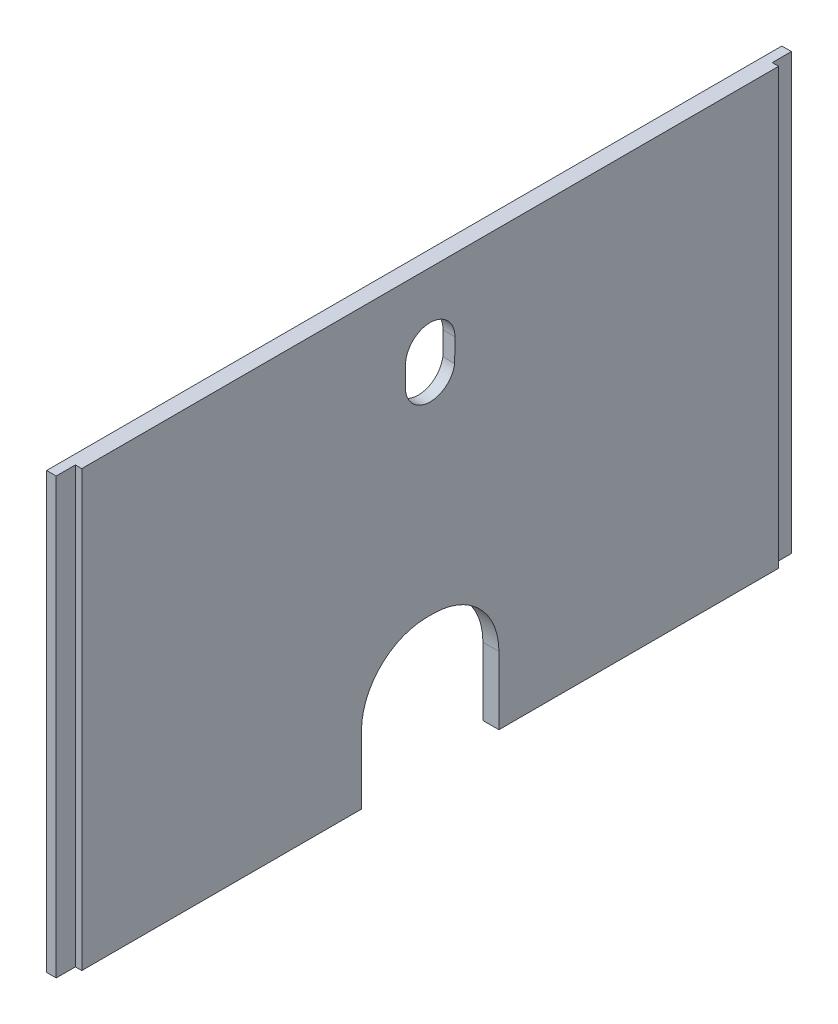
ISO-10303-21;
HEADER;
FILE_DESCRIPTION(('STEP AP214'),'2;1');
FILE_NAME('part.step','',(''),(''),'','','');
FILE_SCHEMA(('AUTOMOTIVE_DESIGN { 1 0 10303 214 1 1 1 1 }'));
ENDSEC;
DATA;
#1=APPLICATION_CONTEXT('core data for automotive mechanical design processes');
#2=APPLICATION_PROTOCOL_DEFINITION('international standard','automotive_design',2000,#1);
#3=PRODUCT_CONTEXT('',#1,'mechanical');
#4=PRODUCT('Part','Part','',(#3));
#5=PRODUCT_RELATED_PRODUCT_CATEGORY('part','',(#4));
#6=PRODUCT_DEFINITION_FORMATION('','',#4);
#7=PRODUCT_DEFINITION_CONTEXT('part definition',#1,'design');
#8=PRODUCT_DEFINITION('design','',#6,#7);
#9=PRODUCT_DEFINITION_SHAPE('','',#8);
#10=(LENGTH_UNIT() NAMED_UNIT(*) SI_UNIT(.MILLI.,.METRE.));
#11=(NAMED_UNIT(*) PLANE_ANGLE_UNIT() SI_UNIT($,.RADIAN.));
#12=(NAMED_UNIT(*) SI_UNIT($,.STERADIAN.) SOLID_ANGLE_UNIT());
#13=UNCERTAINTY_MEASURE_WITH_UNIT(LENGTH_MEASURE(1.E-05),#10,'distance_accuracy_value','');
#14=(GEOMETRIC_REPRESENTATION_CONTEXT(3) GLOBAL_UNCERTAINTY_ASSIGNED_CONTEXT((#13)) GLOBAL_UNIT_ASSIGNED_CONTEXT((#10,
#11,#12)) REPRESENTATION_CONTEXT('',''));
#15=CARTESIAN_POINT('',(0.,0.,0.));
#16=DIRECTION('',(0.,0.,1.));
#17=DIRECTION('',(1.,0.,0.));
#18=AXIS2_PLACEMENT_3D('',#15,#16,#17);
#19=CARTESIAN_POINT('',(0.499999999999993,-34.,0.));
#20=DIRECTION('',(1.,0.,0.));
#21=DIRECTION('',(0.,0.,-1.));
#22=AXIS2_PLACEMENT_3D('',#19,#20,#21);
#23=PLANE('',#22);
#24=DIRECTION('',(0.,1.,0.));
#25=VECTOR('',#24,1.);
#26=CARTESIAN_POINT('',(0.499999999999994,0.,-10.75));
#27=LINE('',#26,#25);
#28=CARTESIAN_POINT('',(0.499999999999992,-34.,-10.75));
#29=VERTEX_POINT('',#28);
#30=CARTESIAN_POINT('',(0.499999999999992,-23.3838115756359,-10.75));
#31=VERTEX_POINT('',#30);
#32=EDGE_CURVE('E429',#29,#31,#27,.T.);
#33=ORIENTED_EDGE('',*,*,#32,.T.);
#34=CARTESIAN_POINT('',(0.499999999999994,-23.3838115756359,-0.500000000000026));
#35=DIRECTION('',(1.,0.,0.));
#36=DIRECTION('',(0.,0.,-1.));
#37=AXIS2_PLACEMENT_3D('',#34,#35,#36);
#38=CIRCLE('',#37,10.25);
#39=CARTESIAN_POINT('',(0.499999999999994,-13.1338115756359,-0.500000000000025));
#40=VERTEX_POINT('',#39);
#41=EDGE_CURVE('E432',#40,#31,#38,.F.);
#42=ORIENTED_EDGE('',*,*,#41,.F.);
#43=DIRECTION('',(0.,0.,1.));
#44=VECTOR('',#43,1.);
#45=CARTESIAN_POINT('',(0.499999999999994,-13.1338115756359,3.37854945034374E-13));
#46=LINE('',#45,#44);
#47=CARTESIAN_POINT('',(0.499999999999994,-13.1338115756359,0.499999999999974));
#48=VERTEX_POINT('',#47);
#49=EDGE_CURVE('E421',#40,#48,#46,.T.);
#50=ORIENTED_EDGE('',*,*,#49,.T.);
#51=CARTESIAN_POINT('',(0.499999999999994,-23.3838115756359,0.499999999999974));
#52=DIRECTION('',(1.,0.,0.));
#53=DIRECTION('',(0.,0.,-1.));
#54=AXIS2_PLACEMENT_3D('',#51,#52,#53);
#55=CIRCLE('',#54,10.25);
#56=CARTESIAN_POINT('',(0.499999999999995,-23.3838115756359,10.75));
#57=VERTEX_POINT('',#56);
#58=EDGE_CURVE('E424',#57,#48,#55,.F.);
#59=ORIENTED_EDGE('',*,*,#58,.F.);
#60=DIRECTION('',(0.,1.,0.));
#61=VECTOR('',#60,1.);
#62=CARTESIAN_POINT('',(0.499999999999994,0.,10.75));
#63=LINE('',#62,#61);
#64=CARTESIAN_POINT('',(0.499999999999994,-34.,10.75));
#65=VERTEX_POINT('',#64);
#66=EDGE_CURVE('E427',#65,#57,#63,.T.);
#67=ORIENTED_EDGE('',*,*,#66,.F.);
#68=DIRECTION('',(0.,0.,-1.));
#69=VECTOR('',#68,1.);
#70=CARTESIAN_POINT('',(0.499999999999993,-34.,0.));
#71=LINE('',#70,#69);
#72=CARTESIAN_POINT('',(0.5,-34.,57.5));
#73=VERTEX_POINT('',#72);
#74=EDGE_CURVE('E460',#73,#65,#71,.T.);
#75=ORIENTED_EDGE('',*,*,#74,.F.);
#76=DIRECTION('',(0.,1.,0.));
#77=VECTOR('',#76,1.);
#78=CARTESIAN_POINT('',(0.5,-34.,57.5));
#79=LINE('',#78,#77);
#80=CARTESIAN_POINT('',(0.5,34.,57.5));
#81=VERTEX_POINT('',#80);
#82=EDGE_CURVE('E499',#73,#81,#79,.T.);
#83=ORIENTED_EDGE('',*,*,#82,.T.);
#84=DIRECTION('',(0.,0.,-1.));
#85=VECTOR('',#84,1.);
#86=CARTESIAN_POINT('',(0.499999999999993,34.,0.));
#87=LINE('',#86,#85);
#88=CARTESIAN_POINT('',(0.499999999999194,34.,-57.5));
#89=VERTEX_POINT('',#88);
#90=EDGE_CURVE('E459',#81,#89,#87,.T.);
#91=ORIENTED_EDGE('',*,*,#90,.T.);
#92=DIRECTION('',(0.,1.,0.));
#93=VECTOR('',#92,1.);
#94=CARTESIAN_POINT('',(0.499999999999194,-34.,-57.5));
#95=LINE('',#94,#93);
#96=CARTESIAN_POINT('',(0.499999999999194,-34.,-57.5));
#97=VERTEX_POINT('',#96);
#98=EDGE_CURVE('E479',#97,#89,#95,.T.);
#99=ORIENTED_EDGE('',*,*,#98,.F.);
#100=EDGE_CURVE('E464',#29,#97,#71,.T.);
#101=ORIENTED_EDGE('',*,*,#100,.F.);
#102=EDGE_LOOP('',(#33,#42,#50,#59,#67,#75,#83,#91,#99,#101));
#103=FACE_BOUND('',#102,.T.);
#104=DIRECTION('',(0.,0.,1.));
#105=VECTOR('',#104,1.);
#106=CARTESIAN_POINT('',(0.499999999999992,14.5500000000001,-4.49999999999981));
#107=LINE('',#106,#105);
#108=CARTESIAN_POINT('',(0.499999999999992,14.5500000000001,-4.49999999999981));
#109=VERTEX_POINT('',#108);
#110=CARTESIAN_POINT('',(0.499999999999993,14.5500000000001,4.50000000000025));
#111=VERTEX_POINT('',#110);
#112=EDGE_CURVE('E377',#109,#111,#107,.T.);
#113=ORIENTED_EDGE('',*,*,#112,.F.);
#114=DIRECTION('',(0.,-1.,0.));
#115=VECTOR('',#114,1.);
#116=CARTESIAN_POINT('',(0.499999999999992,26.5500000000001,-4.49999999999981));
#117=LINE('',#116,#115);
#118=CARTESIAN_POINT('',(0.499999999999992,26.5500000000001,-4.49999999999981));
#119=VERTEX_POINT('',#118);
#120=EDGE_CURVE('E361',#119,#109,#117,.T.);
#121=ORIENTED_EDGE('',*,*,#120,.F.);
#122=DIRECTION('',(0.,0.,-1.));
#123=VECTOR('',#122,1.);
#124=CARTESIAN_POINT('',(0.499999999999992,26.5500000000001,-4.49999999999981));
#125=LINE('',#124,#123);
#126=CARTESIAN_POINT('',(0.499999999999993,26.5500000000001,4.50000000000025));
#127=VERTEX_POINT('',#126);
#128=EDGE_CURVE('E366',#127,#119,#125,.T.);
#129=ORIENTED_EDGE('',*,*,#128,.F.);
#130=DIRECTION('',(0.,1.,0.));
#131=VECTOR('',#130,1.);
#132=CARTESIAN_POINT('',(0.499999999999993,26.5500000000001,4.50000000000025));
#133=LINE('',#132,#131);
#134=EDGE_CURVE('E380',#111,#127,#133,.T.);
#135=ORIENTED_EDGE('',*,*,#134,.F.);
#136=EDGE_LOOP('',(#113,#121,#129,#135));
#137=FACE_BOUND('',#136,.T.);
#138=DIRECTION('',(0.,-1.,0.));
#139=VECTOR('',#138,1.);
#140=CARTESIAN_POINT('',(0.499999999999991,0.,-14.75));
#141=LINE('',#140,#139);
#142=CARTESIAN_POINT('',(0.499999999999991,7.49999999999999,-14.75));
#143=VERTEX_POINT('',#142);
#144=CARTESIAN_POINT('',(0.499999999999991,2.5,-14.75));
#145=VERTEX_POINT('',#144);
#146=EDGE_CURVE('E356',#143,#145,#141,.T.);
#147=ORIENTED_EDGE('',*,*,#146,.F.);
#148=DIRECTION('',(0.,0.,-1.));
#149=VECTOR('',#148,1.);
#150=CARTESIAN_POINT('',(0.499999999999993,7.49999999999999,0.));
#151=LINE('',#150,#149);
#152=CARTESIAN_POINT('',(0.499999999999992,7.49999999999999,-5.99999999999973));
#153=VERTEX_POINT('',#152);
#154=EDGE_CURVE('E284',#153,#143,#151,.T.);
#155=ORIENTED_EDGE('',*,*,#154,.F.);
#156=DIRECTION('',(0.,-1.,0.));
#157=VECTOR('',#156,1.);
#158=CARTESIAN_POINT('',(0.499999999999992,7.49999999999999,-5.99999999999973));
#159=LINE('',#158,#157);
#160=CARTESIAN_POINT('',(0.499999999999992,4.49999999999999,-5.99999999999973));
#161=VERTEX_POINT('',#160);
#162=EDGE_CURVE('E324',#153,#161,#159,.T.);
#163=ORIENTED_EDGE('',*,*,#162,.T.);
#164=DIRECTION('',(0.,0.,1.));
#165=VECTOR('',#164,1.);
#166=CARTESIAN_POINT('',(0.499999999999993,4.49999999999999,0.));
#167=LINE('',#166,#165);
#168=CARTESIAN_POINT('',(0.499999999999993,4.49999999999999,5.00000000000027));
#169=VERTEX_POINT('',#168);
#170=EDGE_CURVE('E353',#161,#169,#167,.T.);
#171=ORIENTED_EDGE('',*,*,#170,.T.);
#172=DIRECTION('',(0.,-1.,0.));
#173=VECTOR('',#172,1.);
#174=CARTESIAN_POINT('',(0.499999999999993,7.49999999999999,5.00000000000027));
#175=LINE('',#174,#173);
#176=CARTESIAN_POINT('',(0.499999999999993,7.49999999999999,5.00000000000027));
#177=VERTEX_POINT('',#176);
#178=EDGE_CURVE('E270',#177,#169,#175,.T.);
#179=ORIENTED_EDGE('',*,*,#178,.F.);
#180=CARTESIAN_POINT('',(0.499999999999995,7.49999999999999,14.75));
#181=VERTEX_POINT('',#180);
#182=EDGE_CURVE('E291',#181,#177,#151,.T.);
#183=ORIENTED_EDGE('',*,*,#182,.F.);
#184=DIRECTION('',(0.,-1.,0.));
#185=VECTOR('',#184,1.);
#186=CARTESIAN_POINT('',(0.499999999999995,0.,14.75));
#187=LINE('',#186,#185);
#188=CARTESIAN_POINT('',(0.499999999999995,2.5,14.75));
#189=VERTEX_POINT('',#188);
#190=EDGE_CURVE('E350',#181,#189,#187,.T.);
#191=ORIENTED_EDGE('',*,*,#190,.T.);
#192=DIRECTION('',(0.,0.,1.));
#193=VECTOR('',#192,1.);
#194=CARTESIAN_POINT('',(0.499999999999993,2.5,0.));
#195=LINE('',#194,#193);
#196=EDGE_CURVE('E347',#145,#189,#195,.T.);
#197=ORIENTED_EDGE('',*,*,#196,.F.);
#198=EDGE_LOOP('',(#147,#155,#163,#171,#179,#183,#191,#197));
#199=FACE_BOUND('',#198,.T.);
#200=ADVANCED_FACE('F41',(#103,#137,#199),#23,.F.);
#201=CARTESIAN_POINT('',(-7.50000000000001,2.5,0.));
#202=DIRECTION('',(0.,1.,0.));
#203=DIRECTION('',(0.,0.,1.));
#204=AXIS2_PLACEMENT_3D('',#201,#202,#203);
#205=PLANE('',#204);
#206=DIRECTION('',(0.,0.,1.));
#207=VECTOR('',#206,1.);
#208=CARTESIAN_POINT('',(-5.93549467935518,2.5,0.));
#209=LINE('',#208,#207);
#210=CARTESIAN_POINT('',(-5.93549467935518,2.5,-14.75));
#211=VERTEX_POINT('',#210);
#212=CARTESIAN_POINT('',(-5.93549467935518,2.5,14.75));
#213=VERTEX_POINT('',#212);
#214=EDGE_CURVE('E344',#211,#213,#209,.T.);
#215=ORIENTED_EDGE('',*,*,#214,.F.);
#216=DIRECTION('',(1.,0.,0.));
#217=VECTOR('',#216,1.);
#218=CARTESIAN_POINT('',(-7.50000000000001,2.5,-14.75));
#219=LINE('',#218,#217);
#220=EDGE_CURVE('E266',#211,#145,#219,.T.);
#221=ORIENTED_EDGE('',*,*,#220,.T.);
#222=ORIENTED_EDGE('',*,*,#196,.T.);
#223=DIRECTION('',(1.,0.,0.));
#224=VECTOR('',#223,1.);
#225=CARTESIAN_POINT('',(-7.50000000000001,2.5,14.75));
#226=LINE('',#225,#224);
#227=EDGE_CURVE('E359',#213,#189,#226,.T.);
#228=ORIENTED_EDGE('',*,*,#227,.F.);
#229=EDGE_LOOP('',(#215,#221,#222,#228));
#230=FACE_BOUND('',#229,.T.);
#231=ADVANCED_FACE('F596',(#230),#205,.F.);
#232=CARTESIAN_POINT('',(-7.50000000000001,0.,14.75));
#233=DIRECTION('',(0.,0.,1.));
#234=DIRECTION('',(0.,-1.,0.));
#235=AXIS2_PLACEMENT_3D('',#232,#233,#234);
#236=PLANE('',#235);
#237=ORIENTED_EDGE('',*,*,#190,.F.);
#238=DIRECTION('',(1.,0.,0.));
#239=VECTOR('',#238,1.);
#240=CARTESIAN_POINT('',(0.,7.49999999999999,14.75));
#241=LINE('',#240,#239);
#242=CARTESIAN_POINT('',(-5.93549467935518,7.49999999999999,14.75));
#243=VERTEX_POINT('',#242);
#244=EDGE_CURVE('E279',#243,#181,#241,.T.);
#245=ORIENTED_EDGE('',*,*,#244,.F.);
#246=DIRECTION('',(0.,1.,0.));
#247=VECTOR('',#246,1.);
#248=CARTESIAN_POINT('',(-5.93549467935518,-3.50000000000001,14.75));
#249=LINE('',#248,#247);
#250=EDGE_CURVE('E269',#213,#243,#249,.T.);
#251=ORIENTED_EDGE('',*,*,#250,.F.);
#252=ORIENTED_EDGE('',*,*,#227,.T.);
#253=EDGE_LOOP('',(#237,#245,#251,#252));
#254=FACE_BOUND('',#253,.T.);
#255=ADVANCED_FACE('F601',(#254),#236,.T.);
#256=CARTESIAN_POINT('',(-7.50000000000001,4.49999999999999,0.));
#257=DIRECTION('',(0.,1.,0.));
#258=DIRECTION('',(0.,0.,1.));
#259=AXIS2_PLACEMENT_3D('',#256,#257,#258);
#260=PLANE('',#259);
#261=DIRECTION('',(1.,0.,0.));
#262=VECTOR('',#261,1.);
#263=CARTESIAN_POINT('',(0.,4.49999999999999,5.00000000000028));
#264=LINE('',#263,#262);
#265=CARTESIAN_POINT('',(-1.93549467935518,4.49999999999999,5.00000000000027));
#266=VERTEX_POINT('',#265);
#267=EDGE_CURVE('E315',#266,#169,#264,.T.);
#268=ORIENTED_EDGE('',*,*,#267,.T.);
#269=ORIENTED_EDGE('',*,*,#170,.F.);
#270=DIRECTION('',(-1.,0.,0.));
#271=VECTOR('',#270,1.);
#272=CARTESIAN_POINT('',(0.,4.49999999999999,-5.99999999999973));
#273=LINE('',#272,#271);
#274=CARTESIAN_POINT('',(-1.93549467935518,4.49999999999999,-5.99999999999973));
#275=VERTEX_POINT('',#274);
#276=EDGE_CURVE('E285',#161,#275,#273,.T.);
#277=ORIENTED_EDGE('',*,*,#276,.T.);
#278=DIRECTION('',(0.,0.,-1.));
#279=VECTOR('',#278,1.);
#280=CARTESIAN_POINT('',(-1.93549467935518,4.49999999999999,0.));
#281=LINE('',#280,#279);
#282=CARTESIAN_POINT('',(-1.93549467935518,4.49999999999999,-12.9999999999997));
#283=VERTEX_POINT('',#282);
#284=EDGE_CURVE('E287',#275,#283,#281,.T.);
#285=ORIENTED_EDGE('',*,*,#284,.T.);
#286=DIRECTION('',(-1.,0.,0.));
#287=VECTOR('',#286,1.);
#288=CARTESIAN_POINT('',(0.,4.49999999999999,-12.9999999999997));
#289=LINE('',#288,#287);
#290=CARTESIAN_POINT('',(-3.93549467935518,4.49999999999999,-12.9999999999997));
#291=VERTEX_POINT('',#290);
#292=EDGE_CURVE('E321',#283,#291,#289,.T.);
#293=ORIENTED_EDGE('',*,*,#292,.T.);
#294=DIRECTION('',(0.,0.,1.));
#295=VECTOR('',#294,1.);
#296=CARTESIAN_POINT('',(-3.93549467935518,4.49999999999999,0.));
#297=LINE('',#296,#295);
#298=CARTESIAN_POINT('',(-3.93549467935518,4.49999999999999,13.0000000000003));
#299=VERTEX_POINT('',#298);
#300=EDGE_CURVE('E319',#291,#299,#297,.T.);
#301=ORIENTED_EDGE('',*,*,#300,.T.);
#302=DIRECTION('',(1.,0.,0.));
#303=VECTOR('',#302,1.);
#304=CARTESIAN_POINT('',(0.,4.49999999999999,13.0000000000003));
#305=LINE('',#304,#303);
#306=CARTESIAN_POINT('',(-1.93549467935518,4.49999999999999,13.0000000000003));
#307=VERTEX_POINT('',#306);
#308=EDGE_CURVE('E61',#299,#307,#305,.T.);
#309=ORIENTED_EDGE('',*,*,#308,.T.);
#310=DIRECTION('',(0.,0.,-1.));
#311=VECTOR('',#310,1.);
#312=CARTESIAN_POINT('',(-1.93549467935518,4.49999999999999,0.));
#313=LINE('',#312,#311);
#314=EDGE_CURVE('E56',#307,#266,#313,.T.);
#315=ORIENTED_EDGE('',*,*,#314,.T.);
#316=EDGE_LOOP('',(#268,#269,#277,#285,#293,#301,#309,#315));
#317=FACE_BOUND('',#316,.T.);
#318=ADVANCED_FACE('F771',(#317),#260,.T.);
#319=CARTESIAN_POINT('',(-7.50000000000001,0.,-14.75));
#320=DIRECTION('',(0.,0.,1.));
#321=DIRECTION('',(0.,-1.,0.));
#322=AXIS2_PLACEMENT_3D('',#319,#320,#321);
#323=PLANE('',#322);
#324=DIRECTION('',(0.,1.,0.));
#325=VECTOR('',#324,1.);
#326=CARTESIAN_POINT('',(-5.93549467935518,-3.50000000000001,-14.75));
#327=LINE('',#326,#325);
#328=CARTESIAN_POINT('',(-5.93549467935518,7.49999999999999,-14.75));
#329=VERTEX_POINT('',#328);
#330=EDGE_CURVE('E260',#211,#329,#327,.T.);
#331=ORIENTED_EDGE('',*,*,#330,.T.);
#332=DIRECTION('',(-1.,0.,0.));
#333=VECTOR('',#332,1.);
#334=CARTESIAN_POINT('',(0.,7.49999999999999,-14.75));
#335=LINE('',#334,#333);
#336=EDGE_CURVE('E265',#143,#329,#335,.T.);
#337=ORIENTED_EDGE('',*,*,#336,.F.);
#338=ORIENTED_EDGE('',*,*,#146,.T.);
#339=ORIENTED_EDGE('',*,*,#220,.F.);
#340=EDGE_LOOP('',(#331,#337,#338,#339));
#341=FACE_BOUND('',#340,.T.);
#342=ADVANCED_FACE('F262',(#341),#323,.F.);
#343=CARTESIAN_POINT('',(-12.7523582806986,-0.0475998106973776,-3.57234991047825));
#344=DIRECTION('',(0.,0.013323326929512,0.999911240540644));
#345=DIRECTION('',(0.,-0.999911240540644,0.013323326929512));
#346=AXIS2_PLACEMENT_3D('',#343,#344,#345);
#347=PLANE('',#346);
#348=DIRECTION('',(1.,0.,0.));
#349=VECTOR('',#348,1.);
#350=CARTESIAN_POINT('',(-12.7523582806986,22.6661884243642,-3.875));
#351=LINE('',#350,#349);
#352=CARTESIAN_POINT('',(1.14999999999999,22.6661884243642,-3.875));
#353=VERTEX_POINT('',#352);
#354=CARTESIAN_POINT('',(3.,22.6661884243642,-3.875));
#355=VERTEX_POINT('',#354);
#356=EDGE_CURVE('E412',#353,#355,#351,.T.);
#357=ORIENTED_EDGE('',*,*,#356,.F.);
#358=DIRECTION('',(0.,-0.999911240540644,0.013323326929512));
#359=VECTOR('',#358,1.);
#360=CARTESIAN_POINT('',(1.14999999999999,-0.0475998106973776,-3.57234991047825));
#361=LINE('',#360,#359);
#362=CARTESIAN_POINT('',(1.14999999999999,19.0576458345906,-3.82691793959969));
#363=VERTEX_POINT('',#362);
#364=EDGE_CURVE('E397',#353,#363,#361,.T.);
#365=ORIENTED_EDGE('',*,*,#364,.T.);
#366=DIRECTION('',(1.,0.,0.));
#367=VECTOR('',#366,1.);
#368=CARTESIAN_POINT('',(-12.7523582806986,19.0576458345906,-3.82691793959969));
#369=LINE('',#368,#367);
#370=CARTESIAN_POINT('',(3.,19.0576458345906,-3.82691793959969));
#371=VERTEX_POINT('',#370);
#372=EDGE_CURVE('E413',#363,#371,#369,.T.);
#373=ORIENTED_EDGE('',*,*,#372,.T.);
#374=DIRECTION('',(0.,-0.999911240540644,0.013323326929512));
#375=VECTOR('',#374,1.);
#376=CARTESIAN_POINT('',(3.,-0.0475998106973776,-3.57234991047825));
#377=LINE('',#376,#375);
#378=EDGE_CURVE('E400',#355,#371,#377,.T.);
#379=ORIENTED_EDGE('',*,*,#378,.F.);
#380=EDGE_LOOP('',(#357,#365,#373,#379));
#381=FACE_BOUND('',#380,.T.);
#382=ADVANCED_FACE('F659',(#381),#347,.T.);
#383=CARTESIAN_POINT('',(-12.7523582806986,19.6661884243642,2.21202882386381E-13));
#384=DIRECTION('',(1.,0.,0.));
#385=DIRECTION('',(0.,0.,-1.));
#386=AXIS2_PLACEMENT_3D('',#383,#384,#385);
#387=CYLINDRICAL_SURFACE('',#386,3.875);
#388=CARTESIAN_POINT('',(1.14999999999999,19.6661884243642,2.21202882386381E-13));
#389=DIRECTION('',(-1.,0.,0.));
#390=DIRECTION('',(0.,0.,1.));
#391=AXIS2_PLACEMENT_3D('',#388,#389,#390);
#392=CIRCLE('',#391,3.875);
#393=CARTESIAN_POINT('',(1.14999999999999,19.0576458345906,3.82691793960013));
#394=VERTEX_POINT('',#393);
#395=EDGE_CURVE('E395',#394,#363,#392,.F.);
#396=ORIENTED_EDGE('',*,*,#395,.F.);
#397=DIRECTION('',(1.,0.,0.));
#398=VECTOR('',#397,1.);
#399=CARTESIAN_POINT('',(-12.7523582806986,19.0576458345906,3.82691793960013));
#400=LINE('',#399,#398);
#401=CARTESIAN_POINT('',(3.,19.0576458345906,3.82691793960013));
#402=VERTEX_POINT('',#401);
#403=EDGE_CURVE('E416',#394,#402,#400,.T.);
#404=ORIENTED_EDGE('',*,*,#403,.T.);
#405=CARTESIAN_POINT('',(3.,19.6661884243642,2.21202882386381E-13));
#406=DIRECTION('',(1.,0.,0.));
#407=DIRECTION('',(0.,0.,-1.));
#408=AXIS2_PLACEMENT_3D('',#405,#406,#407);
#409=CIRCLE('',#408,3.875);
#410=EDGE_CURVE('E409',#402,#371,#409,.T.);
#411=ORIENTED_EDGE('',*,*,#410,.T.);
#412=ORIENTED_EDGE('',*,*,#372,.F.);
#413=EDGE_LOOP('',(#396,#404,#411,#412));
#414=FACE_BOUND('',#413,.T.);
#415=ADVANCED_FACE('F664',(#414),#387,.F.);
#416=CARTESIAN_POINT('',(-12.7523582806986,-0.0475998106969768,3.57234991048104));
#417=DIRECTION('',(0.,-0.0133233269293894,0.999911240540645));
#418=DIRECTION('',(0.,-0.999911240540646,-0.0133233269293894));
#419=AXIS2_PLACEMENT_3D('',#416,#417,#418);
#420=PLANE('',#419);
#421=DIRECTION('',(0.,-0.999911240540646,-0.0133233269293894));
#422=VECTOR('',#421,1.);
#423=CARTESIAN_POINT('',(1.14999999999999,-0.0475998106969769,3.57234991048104));
#424=LINE('',#423,#422);
#425=CARTESIAN_POINT('',(1.14999999999999,22.6661884243642,3.875));
#426=VERTEX_POINT('',#425);
#427=EDGE_CURVE('E387',#426,#394,#424,.T.);
#428=ORIENTED_EDGE('',*,*,#427,.F.);
#429=DIRECTION('',(1.,0.,0.));
#430=VECTOR('',#429,1.);
#431=CARTESIAN_POINT('',(-12.7523582806986,22.6661884243642,3.875));
#432=LINE('',#431,#430);
#433=CARTESIAN_POINT('',(3.,22.6661884243642,3.875));
#434=VERTEX_POINT('',#433);
#435=EDGE_CURVE('E418',#426,#434,#432,.T.);
#436=ORIENTED_EDGE('',*,*,#435,.T.);
#437=DIRECTION('',(0.,-0.999911240540646,-0.0133233269293894));
#438=VECTOR('',#437,1.);
#439=CARTESIAN_POINT('',(3.,-0.0475998106969768,3.57234991048104));
#440=LINE('',#439,#438);
#441=EDGE_CURVE('E406',#434,#402,#440,.T.);
#442=ORIENTED_EDGE('',*,*,#441,.T.);
#443=ORIENTED_EDGE('',*,*,#403,.F.);
#444=EDGE_LOOP('',(#428,#436,#442,#443));
#445=FACE_BOUND('',#444,.T.);
#446=ADVANCED_FACE('F676',(#445),#420,.F.);
#447=CARTESIAN_POINT('',(-12.7523582806986,22.6661884243642,0.));
#448=DIRECTION('',(1.,0.,0.));
#449=DIRECTION('',(0.,0.,-1.));
#450=AXIS2_PLACEMENT_3D('',#447,#448,#449);
#451=CYLINDRICAL_SURFACE('',#450,3.875);
#452=CARTESIAN_POINT('',(1.14999999999999,22.6661884243642,0.));
#453=DIRECTION('',(-1.,0.,0.));
#454=DIRECTION('',(0.,0.,1.));
#455=AXIS2_PLACEMENT_3D('',#452,#453,#454);
#456=CIRCLE('',#455,3.875);
#457=EDGE_CURVE('E11',#353,#426,#456,.F.);
#458=ORIENTED_EDGE('',*,*,#457,.F.);
#459=ORIENTED_EDGE('',*,*,#356,.T.);
#460=CARTESIAN_POINT('',(3.,22.6661884243642,0.));
#461=DIRECTION('',(1.,0.,0.));
#462=DIRECTION('',(0.,0.,-1.));
#463=AXIS2_PLACEMENT_3D('',#460,#461,#462);
#464=CIRCLE('',#463,3.875);
#465=EDGE_CURVE('E403',#355,#434,#464,.T.);
#466=ORIENTED_EDGE('',*,*,#465,.T.);
#467=ORIENTED_EDGE('',*,*,#435,.F.);
#468=EDGE_LOOP('',(#458,#459,#466,#467));
#469=FACE_BOUND('',#468,.T.);
#470=ADVANCED_FACE('F608',(#469),#451,.F.);
#471=CARTESIAN_POINT('',(3.,0.,0.));
#472=DIRECTION('',(1.,0.,0.));
#473=DIRECTION('',(0.,0.,-1.));
#474=AXIS2_PLACEMENT_3D('',#471,#472,#473);
#475=PLANE('',#474);
#476=CARTESIAN_POINT('',(3.,-23.3838115756359,-0.500000000000026));
#477=DIRECTION('',(1.,0.,0.));
#478=DIRECTION('',(0.,0.,-1.));
#479=AXIS2_PLACEMENT_3D('',#476,#477,#478);
#480=CIRCLE('',#479,10.25);
#481=CARTESIAN_POINT('',(3.,-23.3838115756359,-10.75));
#482=VERTEX_POINT('',#481);
#483=CARTESIAN_POINT('',(3.,-13.1338115756359,-0.500000000000025));
#484=VERTEX_POINT('',#483);
#485=EDGE_CURVE('E435',#482,#484,#480,.T.);
#486=ORIENTED_EDGE('',*,*,#485,.F.);
#487=DIRECTION('',(0.,-1.,0.));
#488=VECTOR('',#487,1.);
#489=CARTESIAN_POINT('',(3.,0.,-10.75));
#490=LINE('',#489,#488);
#491=CARTESIAN_POINT('',(3.,-34.,-10.75));
#492=VERTEX_POINT('',#491);
#493=EDGE_CURVE('E415',#482,#492,#490,.T.);
#494=ORIENTED_EDGE('',*,*,#493,.T.);
#495=DIRECTION('',(0.,0.,-1.));
#496=VECTOR('',#495,1.);
#497=CARTESIAN_POINT('',(3.,-34.,60.));
#498=LINE('',#497,#496);
#499=CARTESIAN_POINT('',(3.,-34.,-54.5));
#500=VERTEX_POINT('',#499);
#501=EDGE_CURVE('E517',#492,#500,#498,.T.);
#502=ORIENTED_EDGE('',*,*,#501,.T.);
#503=DIRECTION('',(0.,1.,0.));
#504=VECTOR('',#503,1.);
#505=CARTESIAN_POINT('',(3.,-34.,-54.5));
#506=LINE('',#505,#504);
#507=CARTESIAN_POINT('',(3.,34.,-54.5));
#508=VERTEX_POINT('',#507);
#509=EDGE_CURVE('E508',#500,#508,#506,.T.);
#510=ORIENTED_EDGE('',*,*,#509,.T.);
#511=DIRECTION('',(0.,0.,1.));
#512=VECTOR('',#511,1.);
#513=CARTESIAN_POINT('',(3.,34.,60.));
#514=LINE('',#513,#512);
#515=CARTESIAN_POINT('',(3.,34.,54.5));
#516=VERTEX_POINT('',#515);
#517=EDGE_CURVE('E501',#508,#516,#514,.T.);
#518=ORIENTED_EDGE('',*,*,#517,.T.);
#519=DIRECTION('',(0.,1.,0.));
#520=VECTOR('',#519,1.);
#521=CARTESIAN_POINT('',(3.,-34.,54.5));
#522=LINE('',#521,#520);
#523=CARTESIAN_POINT('',(3.,-34.,54.5));
#524=VERTEX_POINT('',#523);
#525=EDGE_CURVE('E506',#524,#516,#522,.T.);
#526=ORIENTED_EDGE('',*,*,#525,.F.);
#527=CARTESIAN_POINT('',(3.,-34.,10.75));
#528=VERTEX_POINT('',#527);
#529=EDGE_CURVE('E49',#524,#528,#498,.T.);
#530=ORIENTED_EDGE('',*,*,#529,.T.);
#531=DIRECTION('',(0.,-1.,0.));
#532=VECTOR('',#531,1.);
#533=CARTESIAN_POINT('',(3.,0.,10.75));
#534=LINE('',#533,#532);
#535=CARTESIAN_POINT('',(3.,-23.3838115756359,10.75));
#536=VERTEX_POINT('',#535);
#537=EDGE_CURVE('E444',#536,#528,#534,.T.);
#538=ORIENTED_EDGE('',*,*,#537,.F.);
#539=CARTESIAN_POINT('',(3.,-23.3838115756359,0.499999999999974));
#540=DIRECTION('',(1.,0.,0.));
#541=DIRECTION('',(0.,0.,-1.));
#542=AXIS2_PLACEMENT_3D('',#539,#540,#541);
#543=CIRCLE('',#542,10.25);
#544=CARTESIAN_POINT('',(3.,-13.1338115756359,0.499999999999974));
#545=VERTEX_POINT('',#544);
#546=EDGE_CURVE('E441',#545,#536,#543,.T.);
#547=ORIENTED_EDGE('',*,*,#546,.F.);
#548=DIRECTION('',(0.,0.,-1.));
#549=VECTOR('',#548,1.);
#550=CARTESIAN_POINT('',(3.,-13.1338115756359,3.41752969039673E-13));
#551=LINE('',#550,#549);
#552=EDGE_CURVE('E438',#545,#484,#551,.T.);
#553=ORIENTED_EDGE('',*,*,#552,.T.);
#554=EDGE_LOOP('',(#486,#494,#502,#510,#518,#526,#530,#538,#547,#553));
#555=FACE_BOUND('',#554,.T.);
#556=ORIENTED_EDGE('',*,*,#465,.F.);
#557=ORIENTED_EDGE('',*,*,#378,.T.);
#558=ORIENTED_EDGE('',*,*,#410,.F.);
#559=ORIENTED_EDGE('',*,*,#441,.F.);
#560=EDGE_LOOP('',(#556,#557,#558,#559));
#561=FACE_BOUND('',#560,.T.);
#562=ADVANCED_FACE('F526',(#555,#561),#475,.T.);
#563=CARTESIAN_POINT('',(3.,-34.,60.));
#564=DIRECTION('',(0.,1.,0.));
#565=DIRECTION('',(0.,0.,1.));
#566=AXIS2_PLACEMENT_3D('',#563,#564,#565);
#567=PLANE('',#566);
#568=DIRECTION('',(1.,0.,0.));
#569=VECTOR('',#568,1.);
#570=CARTESIAN_POINT('',(-29.4607713412233,-34.,-10.75));
#571=LINE('',#570,#569);
#572=EDGE_CURVE('E425',#29,#492,#571,.T.);
#573=ORIENTED_EDGE('',*,*,#572,.F.);
#574=ORIENTED_EDGE('',*,*,#100,.T.);
#575=DIRECTION('',(1.,0.,0.));
#576=VECTOR('',#575,1.);
#577=CARTESIAN_POINT('',(-1.06396373193244E-12,-34.,-57.5));
#578=LINE('',#577,#576);
#579=CARTESIAN_POINT('',(1.9999999999992,-34.,-57.5));
#580=VERTEX_POINT('',#579);
#581=EDGE_CURVE('E463',#97,#580,#578,.T.);
#582=ORIENTED_EDGE('',*,*,#581,.T.);
#583=DIRECTION('',(0.,0.,1.));
#584=VECTOR('',#583,1.);
#585=CARTESIAN_POINT('',(2.,-34.,0.));
#586=LINE('',#585,#584);
#587=CARTESIAN_POINT('',(1.99999999999924,-34.,-54.5));
#588=VERTEX_POINT('',#587);
#589=EDGE_CURVE('E467',#580,#588,#586,.T.);
#590=ORIENTED_EDGE('',*,*,#589,.T.);
#591=DIRECTION('',(1.,0.,0.));
#592=VECTOR('',#591,1.);
#593=CARTESIAN_POINT('',(-7.56339435525888E-13,-34.,-54.5));
#594=LINE('',#593,#592);
#595=EDGE_CURVE('E470',#588,#500,#594,.T.);
#596=ORIENTED_EDGE('',*,*,#595,.T.);
#597=ORIENTED_EDGE('',*,*,#501,.F.);
#598=EDGE_LOOP('',(#573,#574,#582,#590,#596,#597));
#599=FACE_BOUND('',#598,.T.);
#600=ADVANCED_FACE('F536',(#599),#567,.F.);
#601=CARTESIAN_POINT('',(3.,34.,60.));
#602=DIRECTION('',(0.,-1.,0.));
#603=DIRECTION('',(0.,0.,-1.));
#604=AXIS2_PLACEMENT_3D('',#601,#602,#603);
#605=PLANE('',#604);
#606=DIRECTION('',(1.,0.,0.));
#607=VECTOR('',#606,1.);
#608=CARTESIAN_POINT('',(0.,34.,54.5));
#609=LINE('',#608,#607);
#610=CARTESIAN_POINT('',(2.,34.,54.5));
#611=VERTEX_POINT('',#610);
#612=EDGE_CURVE('E490',#611,#516,#609,.T.);
#613=ORIENTED_EDGE('',*,*,#612,.T.);
#614=ORIENTED_EDGE('',*,*,#517,.F.);
#615=DIRECTION('',(1.,0.,0.));
#616=VECTOR('',#615,1.);
#617=CARTESIAN_POINT('',(-7.56339435525888E-13,34.,-54.5));
#618=LINE('',#617,#616);
#619=CARTESIAN_POINT('',(1.99999999999924,34.,-54.5));
#620=VERTEX_POINT('',#619);
#621=EDGE_CURVE('E488',#620,#508,#618,.T.);
#622=ORIENTED_EDGE('',*,*,#621,.F.);
#623=DIRECTION('',(0.,0.,1.));
#624=VECTOR('',#623,1.);
#625=CARTESIAN_POINT('',(2.,34.,0.));
#626=LINE('',#625,#624);
#627=CARTESIAN_POINT('',(1.9999999999992,34.,-57.5));
#628=VERTEX_POINT('',#627);
#629=EDGE_CURVE('E485',#628,#620,#626,.T.);
#630=ORIENTED_EDGE('',*,*,#629,.F.);
#631=DIRECTION('',(1.,0.,0.));
#632=VECTOR('',#631,1.);
#633=CARTESIAN_POINT('',(-1.06396373193244E-12,34.,-57.5));
#634=LINE('',#633,#632);
#635=EDGE_CURVE('E482',#89,#628,#634,.T.);
#636=ORIENTED_EDGE('',*,*,#635,.F.);
#637=ORIENTED_EDGE('',*,*,#90,.F.);
#638=DIRECTION('',(1.,0.,0.));
#639=VECTOR('',#638,1.);
#640=CARTESIAN_POINT('',(0.,34.,57.5));
#641=LINE('',#640,#639);
#642=CARTESIAN_POINT('',(2.,34.,57.5));
#643=VERTEX_POINT('',#642);
#644=EDGE_CURVE('E496',#81,#643,#641,.T.);
#645=ORIENTED_EDGE('',*,*,#644,.T.);
#646=DIRECTION('',(0.,0.,-1.));
#647=VECTOR('',#646,1.);
#648=CARTESIAN_POINT('',(2.,34.,0.));
#649=LINE('',#648,#647);
#650=EDGE_CURVE('E493',#643,#611,#649,.T.);
#651=ORIENTED_EDGE('',*,*,#650,.T.);
#652=EDGE_LOOP('',(#613,#614,#622,#630,#636,#637,#645,#651));
#653=FACE_BOUND('',#652,.T.);
#654=ADVANCED_FACE('F43',(#653),#605,.F.);
#655=ORIENTED_EDGE('',*,*,#74,.T.);
#656=DIRECTION('',(1.,0.,0.));
#657=VECTOR('',#656,1.);
#658=CARTESIAN_POINT('',(-29.4607713412233,-34.,10.75));
#659=LINE('',#658,#657);
#660=EDGE_CURVE('E448',#65,#528,#659,.T.);
#661=ORIENTED_EDGE('',*,*,#660,.T.);
#662=ORIENTED_EDGE('',*,*,#529,.F.);
#663=DIRECTION('',(1.,0.,0.));
#664=VECTOR('',#663,1.);
#665=CARTESIAN_POINT('',(0.,-34.,54.5));
#666=LINE('',#665,#664);
#667=CARTESIAN_POINT('',(2.,-34.,54.5));
#668=VERTEX_POINT('',#667);
#669=EDGE_CURVE('E473',#668,#524,#666,.T.);
#670=ORIENTED_EDGE('',*,*,#669,.F.);
#671=DIRECTION('',(0.,0.,-1.));
#672=VECTOR('',#671,1.);
#673=CARTESIAN_POINT('',(2.,-34.,0.));
#674=LINE('',#673,#672);
#675=CARTESIAN_POINT('',(2.,-34.,57.5));
#676=VERTEX_POINT('',#675);
#677=EDGE_CURVE('E475',#676,#668,#674,.T.);
#678=ORIENTED_EDGE('',*,*,#677,.F.);
#679=DIRECTION('',(1.,0.,0.));
#680=VECTOR('',#679,1.);
#681=CARTESIAN_POINT('',(0.,-34.,57.5));
#682=LINE('',#681,#680);
#683=EDGE_CURVE('E477',#73,#676,#682,.T.);
#684=ORIENTED_EDGE('',*,*,#683,.F.);
#685=EDGE_LOOP('',(#655,#661,#662,#670,#678,#684));
#686=FACE_BOUND('',#685,.T.);
#687=ADVANCED_FACE('F548',(#686),#567,.F.);
#688=CARTESIAN_POINT('',(0.,-34.,57.5));
#689=DIRECTION('',(0.,0.,1.));
#690=DIRECTION('',(1.,0.,0.));
#691=AXIS2_PLACEMENT_3D('',#688,#689,#690);
#692=PLANE('',#691);
#693=ORIENTED_EDGE('',*,*,#644,.F.);
#694=ORIENTED_EDGE('',*,*,#82,.F.);
#695=ORIENTED_EDGE('',*,*,#683,.T.);
#696=DIRECTION('',(0.,1.,0.));
#697=VECTOR('',#696,1.);
#698=CARTESIAN_POINT('',(2.,-34.,57.5));
#699=LINE('',#698,#697);
#700=EDGE_CURVE('E502',#676,#643,#699,.T.);
#701=ORIENTED_EDGE('',*,*,#700,.T.);
#702=EDGE_LOOP('',(#693,#694,#695,#701));
#703=FACE_BOUND('',#702,.T.);
#704=ADVANCED_FACE('F581',(#703),#692,.T.);
#705=CARTESIAN_POINT('',(2.,-34.,0.));
#706=DIRECTION('',(1.,0.,0.));
#707=DIRECTION('',(0.,0.,-1.));
#708=AXIS2_PLACEMENT_3D('',#705,#706,#707);
#709=PLANE('',#708);
#710=ORIENTED_EDGE('',*,*,#650,.F.);
#711=ORIENTED_EDGE('',*,*,#700,.F.);
#712=ORIENTED_EDGE('',*,*,#677,.T.);
#713=DIRECTION('',(0.,1.,0.));
#714=VECTOR('',#713,1.);
#715=CARTESIAN_POINT('',(2.,-34.,54.5));
#716=LINE('',#715,#714);
#717=EDGE_CURVE('E504',#668,#611,#716,.T.);
#718=ORIENTED_EDGE('',*,*,#717,.T.);
#719=EDGE_LOOP('',(#710,#711,#712,#718));
#720=FACE_BOUND('',#719,.T.);
#721=ADVANCED_FACE('F584',(#720),#709,.T.);
#722=CARTESIAN_POINT('',(0.,-34.,54.5));
#723=DIRECTION('',(0.,0.,1.));
#724=DIRECTION('',(1.,0.,0.));
#725=AXIS2_PLACEMENT_3D('',#722,#723,#724);
#726=PLANE('',#725);
#727=ORIENTED_EDGE('',*,*,#612,.F.);
#728=ORIENTED_EDGE('',*,*,#717,.F.);
#729=ORIENTED_EDGE('',*,*,#669,.T.);
#730=ORIENTED_EDGE('',*,*,#525,.T.);
#731=EDGE_LOOP('',(#727,#728,#729,#730));
#732=FACE_BOUND('',#731,.T.);
#733=ADVANCED_FACE('F586',(#732),#726,.T.);
#734=CARTESIAN_POINT('',(-7.56339435525888E-13,-34.,-54.5));
#735=DIRECTION('',(0.,0.,1.));
#736=DIRECTION('',(1.,0.,0.));
#737=AXIS2_PLACEMENT_3D('',#734,#735,#736);
#738=PLANE('',#737);
#739=ORIENTED_EDGE('',*,*,#621,.T.);
#740=ORIENTED_EDGE('',*,*,#509,.F.);
#741=ORIENTED_EDGE('',*,*,#595,.F.);
#742=DIRECTION('',(0.,1.,0.));
#743=VECTOR('',#742,1.);
#744=CARTESIAN_POINT('',(1.99999999999924,-34.,-54.5));
#745=LINE('',#744,#743);
#746=EDGE_CURVE('E511',#588,#620,#745,.T.);
#747=ORIENTED_EDGE('',*,*,#746,.T.);
#748=EDGE_LOOP('',(#739,#740,#741,#747));
#749=FACE_BOUND('',#748,.T.);
#750=ADVANCED_FACE('F534',(#749),#738,.F.);
#751=CARTESIAN_POINT('',(2.,-34.,0.));
#752=DIRECTION('',(-1.,0.,0.));
#753=DIRECTION('',(0.,0.,1.));
#754=AXIS2_PLACEMENT_3D('',#751,#752,#753);
#755=PLANE('',#754);
#756=ORIENTED_EDGE('',*,*,#629,.T.);
#757=ORIENTED_EDGE('',*,*,#746,.F.);
#758=ORIENTED_EDGE('',*,*,#589,.F.);
#759=DIRECTION('',(0.,1.,0.));
#760=VECTOR('',#759,1.);
#761=CARTESIAN_POINT('',(1.9999999999992,-34.,-57.5));
#762=LINE('',#761,#760);
#763=EDGE_CURVE('E513',#580,#628,#762,.T.);
#764=ORIENTED_EDGE('',*,*,#763,.T.);
#765=EDGE_LOOP('',(#756,#757,#758,#764));
#766=FACE_BOUND('',#765,.T.);
#767=ADVANCED_FACE('F540',(#766),#755,.F.);
#768=CARTESIAN_POINT('',(-1.06396373193244E-12,-34.,-57.5));
#769=DIRECTION('',(0.,0.,1.));
#770=DIRECTION('',(1.,0.,0.));
#771=AXIS2_PLACEMENT_3D('',#768,#769,#770);
#772=PLANE('',#771);
#773=ORIENTED_EDGE('',*,*,#635,.T.);
#774=ORIENTED_EDGE('',*,*,#763,.F.);
#775=ORIENTED_EDGE('',*,*,#581,.F.);
#776=ORIENTED_EDGE('',*,*,#98,.T.);
#777=EDGE_LOOP('',(#773,#774,#775,#776));
#778=FACE_BOUND('',#777,.T.);
#779=ADVANCED_FACE('F577',(#778),#772,.F.);
#780=CARTESIAN_POINT('',(-29.4607713412233,0.,-10.75));
#781=DIRECTION('',(0.,0.,1.));
#782=DIRECTION('',(0.,-1.,0.));
#783=AXIS2_PLACEMENT_3D('',#780,#781,#782);
#784=PLANE('',#783);
#785=ORIENTED_EDGE('',*,*,#572,.T.);
#786=ORIENTED_EDGE('',*,*,#493,.F.);
#787=DIRECTION('',(1.,0.,0.));
#788=VECTOR('',#787,1.);
#789=CARTESIAN_POINT('',(-29.4607713412233,-23.3838115756359,-10.75));
#790=LINE('',#789,#788);
#791=EDGE_CURVE('E446',#31,#482,#790,.T.);
#792=ORIENTED_EDGE('',*,*,#791,.F.);
#793=ORIENTED_EDGE('',*,*,#32,.F.);
#794=EDGE_LOOP('',(#785,#786,#792,#793));
#795=FACE_BOUND('',#794,.T.);
#796=ADVANCED_FACE('F572',(#795),#784,.T.);
#797=CARTESIAN_POINT('',(-29.4607713412233,0.,10.75));
#798=DIRECTION('',(0.,0.,1.));
#799=DIRECTION('',(1.,0.,0.));
#800=AXIS2_PLACEMENT_3D('',#797,#798,#799);
#801=PLANE('',#800);
#802=ORIENTED_EDGE('',*,*,#66,.T.);
#803=DIRECTION('',(1.,0.,0.));
#804=VECTOR('',#803,1.);
#805=CARTESIAN_POINT('',(-29.4607713412233,-23.3838115756359,10.75));
#806=LINE('',#805,#804);
#807=EDGE_CURVE('E451',#57,#536,#806,.T.);
#808=ORIENTED_EDGE('',*,*,#807,.T.);
#809=ORIENTED_EDGE('',*,*,#537,.T.);
#810=ORIENTED_EDGE('',*,*,#660,.F.);
#811=EDGE_LOOP('',(#802,#808,#809,#810));
#812=FACE_BOUND('',#811,.T.);
#813=ADVANCED_FACE('F554',(#812),#801,.F.);
#814=CARTESIAN_POINT('',(-29.4607713412233,-23.3838115756359,0.499999999999974));
#815=DIRECTION('',(1.,0.,0.));
#816=DIRECTION('',(0.,0.,-1.));
#817=AXIS2_PLACEMENT_3D('',#814,#815,#816);
#818=CYLINDRICAL_SURFACE('',#817,10.25);
#819=ORIENTED_EDGE('',*,*,#58,.T.);
#820=DIRECTION('',(1.,0.,0.));
#821=VECTOR('',#820,1.);
#822=CARTESIAN_POINT('',(-29.4607713412233,-13.1338115756359,0.499999999999974));
#823=LINE('',#822,#821);
#824=EDGE_CURVE('E453',#48,#545,#823,.T.);
#825=ORIENTED_EDGE('',*,*,#824,.T.);
#826=ORIENTED_EDGE('',*,*,#546,.T.);
#827=ORIENTED_EDGE('',*,*,#807,.F.);
#828=EDGE_LOOP('',(#819,#825,#826,#827));
#829=FACE_BOUND('',#828,.T.);
#830=ADVANCED_FACE('F563',(#829),#818,.F.);
#831=CARTESIAN_POINT('',(-29.4607713412233,-13.1338115756359,3.41752969039673E-13));
#832=DIRECTION('',(0.,-1.,0.));
#833=DIRECTION('',(0.,0.,-1.));
#834=AXIS2_PLACEMENT_3D('',#831,#832,#833);
#835=PLANE('',#834);
#836=DIRECTION('',(1.,0.,0.));
#837=VECTOR('',#836,1.);
#838=CARTESIAN_POINT('',(-29.4607713412233,-13.1338115756359,-0.500000000000025));
#839=LINE('',#838,#837);
#840=EDGE_CURVE('E455',#40,#484,#839,.T.);
#841=ORIENTED_EDGE('',*,*,#840,.T.);
#842=ORIENTED_EDGE('',*,*,#552,.F.);
#843=ORIENTED_EDGE('',*,*,#824,.F.);
#844=ORIENTED_EDGE('',*,*,#49,.F.);
#845=EDGE_LOOP('',(#841,#842,#843,#844));
#846=FACE_BOUND('',#845,.T.);
#847=ADVANCED_FACE('F566',(#846),#835,.T.);
#848=CARTESIAN_POINT('',(-29.4607713412233,-23.3838115756359,-0.500000000000026));
#849=DIRECTION('',(1.,0.,0.));
#850=DIRECTION('',(0.,0.,-1.));
#851=AXIS2_PLACEMENT_3D('',#848,#849,#850);
#852=CYLINDRICAL_SURFACE('',#851,10.25);
#853=ORIENTED_EDGE('',*,*,#41,.T.);
#854=ORIENTED_EDGE('',*,*,#791,.T.);
#855=ORIENTED_EDGE('',*,*,#485,.T.);
#856=ORIENTED_EDGE('',*,*,#840,.F.);
#857=EDGE_LOOP('',(#853,#854,#855,#856));
#858=FACE_BOUND('',#857,.T.);
#859=ADVANCED_FACE('F569',(#858),#852,.F.);
#860=CARTESIAN_POINT('',(1.14999999999999,26.5500000000001,-4.49999999999981));
#861=DIRECTION('',(0.,0.,-1.));
#862=DIRECTION('',(-1.,0.,0.));
#863=AXIS2_PLACEMENT_3D('',#860,#861,#862);
#864=PLANE('',#863);
#865=ORIENTED_EDGE('',*,*,#120,.T.);
#866=DIRECTION('',(-1.,0.,0.));
#867=VECTOR('',#866,1.);
#868=CARTESIAN_POINT('',(1.14999999999999,14.5500000000001,-4.49999999999981));
#869=LINE('',#868,#867);
#870=CARTESIAN_POINT('',(1.14999999999999,14.5500000000001,-4.49999999999981));
#871=VERTEX_POINT('',#870);
#872=EDGE_CURVE('E375',#871,#109,#869,.T.);
#873=ORIENTED_EDGE('',*,*,#872,.F.);
#874=DIRECTION('',(0.,-1.,0.));
#875=VECTOR('',#874,1.);
#876=CARTESIAN_POINT('',(1.14999999999999,26.5500000000001,-4.49999999999981));
#877=LINE('',#876,#875);
#878=CARTESIAN_POINT('',(1.14999999999999,26.5500000000001,-4.49999999999981));
#879=VERTEX_POINT('',#878);
#880=EDGE_CURVE('E362',#879,#871,#877,.T.);
#881=ORIENTED_EDGE('',*,*,#880,.F.);
#882=DIRECTION('',(-1.,0.,0.));
#883=VECTOR('',#882,1.);
#884=CARTESIAN_POINT('',(1.14999999999999,26.5500000000001,-4.49999999999981));
#885=LINE('',#884,#883);
#886=EDGE_CURVE('E385',#879,#119,#885,.T.);
#887=ORIENTED_EDGE('',*,*,#886,.T.);
#888=EDGE_LOOP('',(#865,#873,#881,#887));
#889=FACE_BOUND('',#888,.T.);
#890=ADVANCED_FACE('F698',(#889),#864,.F.);
#891=CARTESIAN_POINT('',(1.14999999999999,26.5500000000001,-4.49999999999981));
#892=DIRECTION('',(0.,1.,0.));
#893=DIRECTION('',(0.,0.,1.));
#894=AXIS2_PLACEMENT_3D('',#891,#892,#893);
#895=PLANE('',#894);
#896=ORIENTED_EDGE('',*,*,#128,.T.);
#897=ORIENTED_EDGE('',*,*,#886,.F.);
#898=DIRECTION('',(0.,0.,-1.));
#899=VECTOR('',#898,1.);
#900=CARTESIAN_POINT('',(1.14999999999999,26.5500000000001,-4.49999999999981));
#901=LINE('',#900,#899);
#902=CARTESIAN_POINT('',(1.14999999999999,26.5500000000001,4.50000000000025));
#903=VERTEX_POINT('',#902);
#904=EDGE_CURVE('E372',#903,#879,#901,.T.);
#905=ORIENTED_EDGE('',*,*,#904,.F.);
#906=DIRECTION('',(-1.,0.,0.));
#907=VECTOR('',#906,1.);
#908=CARTESIAN_POINT('',(1.14999999999999,26.5500000000001,4.50000000000025));
#909=LINE('',#908,#907);
#910=EDGE_CURVE('E388',#903,#127,#909,.T.);
#911=ORIENTED_EDGE('',*,*,#910,.T.);
#912=EDGE_LOOP('',(#896,#897,#905,#911));
#913=FACE_BOUND('',#912,.T.);
#914=ADVANCED_FACE('F703',(#913),#895,.F.);
#915=CARTESIAN_POINT('',(1.14999999999999,26.5500000000001,4.50000000000025));
#916=DIRECTION('',(0.,0.,1.));
#917=DIRECTION('',(1.,0.,0.));
#918=AXIS2_PLACEMENT_3D('',#915,#916,#917);
#919=PLANE('',#918);
#920=ORIENTED_EDGE('',*,*,#134,.T.);
#921=ORIENTED_EDGE('',*,*,#910,.F.);
#922=DIRECTION('',(0.,1.,0.));
#923=VECTOR('',#922,1.);
#924=CARTESIAN_POINT('',(1.14999999999999,26.5500000000001,4.50000000000025));
#925=LINE('',#924,#923);
#926=CARTESIAN_POINT('',(1.14999999999999,14.5500000000001,4.50000000000025));
#927=VERTEX_POINT('',#926);
#928=EDGE_CURVE('E369',#927,#903,#925,.T.);
#929=ORIENTED_EDGE('',*,*,#928,.F.);
#930=DIRECTION('',(-1.,0.,0.));
#931=VECTOR('',#930,1.);
#932=CARTESIAN_POINT('',(1.14999999999999,14.5500000000001,4.50000000000025));
#933=LINE('',#932,#931);
#934=EDGE_CURVE('E390',#927,#111,#933,.T.);
#935=ORIENTED_EDGE('',*,*,#934,.T.);
#936=EDGE_LOOP('',(#920,#921,#929,#935));
#937=FACE_BOUND('',#936,.T.);
#938=ADVANCED_FACE('F713',(#937),#919,.F.);
#939=CARTESIAN_POINT('',(1.14999999999999,14.5500000000001,-4.49999999999981));
#940=DIRECTION('',(0.,-1.,0.));
#941=DIRECTION('',(0.,0.,-1.));
#942=AXIS2_PLACEMENT_3D('',#939,#940,#941);
#943=PLANE('',#942);
#944=ORIENTED_EDGE('',*,*,#112,.T.);
#945=ORIENTED_EDGE('',*,*,#934,.F.);
#946=DIRECTION('',(0.,0.,1.));
#947=VECTOR('',#946,1.);
#948=CARTESIAN_POINT('',(1.14999999999999,14.5500000000001,-4.49999999999981));
#949=LINE('',#948,#947);
#950=EDGE_CURVE('E365',#871,#927,#949,.T.);
#951=ORIENTED_EDGE('',*,*,#950,.F.);
#952=ORIENTED_EDGE('',*,*,#872,.T.);
#953=EDGE_LOOP('',(#944,#945,#951,#952));
#954=FACE_BOUND('',#953,.T.);
#955=ADVANCED_FACE('F724',(#954),#943,.F.);
#956=CARTESIAN_POINT('',(1.14999999999999,0.,0.));
#957=DIRECTION('',(-1.,0.,0.));
#958=DIRECTION('',(0.,0.,1.));
#959=AXIS2_PLACEMENT_3D('',#956,#957,#958);
#960=PLANE('',#959);
#961=ORIENTED_EDGE('',*,*,#457,.T.);
#962=ORIENTED_EDGE('',*,*,#427,.T.);
#963=ORIENTED_EDGE('',*,*,#395,.T.);
#964=ORIENTED_EDGE('',*,*,#364,.F.);
#965=EDGE_LOOP('',(#961,#962,#963,#964));
#966=FACE_BOUND('',#965,.T.);
#967=ORIENTED_EDGE('',*,*,#880,.T.);
#968=ORIENTED_EDGE('',*,*,#950,.T.);
#969=ORIENTED_EDGE('',*,*,#928,.T.);
#970=ORIENTED_EDGE('',*,*,#904,.T.);
#971=EDGE_LOOP('',(#967,#968,#969,#970));
#972=FACE_BOUND('',#971,.T.);
#973=ADVANCED_FACE('F735',(#966,#972),#960,.T.);
#974=CARTESIAN_POINT('',(-5.93549467935518,-3.50000000000001,0.));
#975=DIRECTION('',(-1.,0.,0.));
#976=DIRECTION('',(0.,0.,1.));
#977=AXIS2_PLACEMENT_3D('',#974,#975,#976);
#978=PLANE('',#977);
#979=ORIENTED_EDGE('',*,*,#214,.T.);
#980=ORIENTED_EDGE('',*,*,#250,.T.);
#981=DIRECTION('',(0.,0.,1.));
#982=VECTOR('',#981,1.);
#983=CARTESIAN_POINT('',(-5.93549467935518,7.49999999999999,0.));
#984=LINE('',#983,#982);
#985=EDGE_CURVE('E273',#329,#243,#984,.T.);
#986=ORIENTED_EDGE('',*,*,#985,.F.);
#987=ORIENTED_EDGE('',*,*,#330,.F.);
#988=EDGE_LOOP('',(#979,#980,#986,#987));
#989=FACE_BOUND('',#988,.T.);
#990=ADVANCED_FACE('F274',(#989),#978,.T.);
#991=CARTESIAN_POINT('',(0.,7.49999999999999,5.00000000000028));
#992=DIRECTION('',(0.,0.,-1.));
#993=DIRECTION('',(-1.,0.,0.));
#994=AXIS2_PLACEMENT_3D('',#991,#992,#993);
#995=PLANE('',#994);
#996=ORIENTED_EDGE('',*,*,#267,.F.);
#997=DIRECTION('',(0.,-1.,0.));
#998=VECTOR('',#997,1.);
#999=CARTESIAN_POINT('',(-1.93549467935518,7.49999999999999,5.00000000000027));
#1000=LINE('',#999,#998);
#1001=CARTESIAN_POINT('',(-1.93549467935518,7.49999999999999,5.00000000000027));
#1002=VERTEX_POINT('',#1001);
#1003=EDGE_CURVE('E340',#1002,#266,#1000,.T.);
#1004=ORIENTED_EDGE('',*,*,#1003,.F.);
#1005=DIRECTION('',(1.,0.,0.));
#1006=VECTOR('',#1005,1.);
#1007=CARTESIAN_POINT('',(0.,7.49999999999999,5.00000000000028));
#1008=LINE('',#1007,#1006);
#1009=EDGE_CURVE('E294',#1002,#177,#1008,.T.);
#1010=ORIENTED_EDGE('',*,*,#1009,.T.);
#1011=ORIENTED_EDGE('',*,*,#178,.T.);
#1012=EDGE_LOOP('',(#996,#1004,#1010,#1011));
#1013=FACE_BOUND('',#1012,.T.);
#1014=ADVANCED_FACE('F798',(#1013),#995,.T.);
#1015=CARTESIAN_POINT('',(-1.93549467935518,7.49999999999999,0.));
#1016=DIRECTION('',(-1.,0.,0.));
#1017=DIRECTION('',(0.,0.,1.));
#1018=AXIS2_PLACEMENT_3D('',#1015,#1016,#1017);
#1019=PLANE('',#1018);
#1020=ORIENTED_EDGE('',*,*,#314,.F.);
#1021=DIRECTION('',(0.,-1.,0.));
#1022=VECTOR('',#1021,1.);
#1023=CARTESIAN_POINT('',(-1.93549467935518,7.49999999999999,13.0000000000003));
#1024=LINE('',#1023,#1022);
#1025=CARTESIAN_POINT('',(-1.93549467935518,7.49999999999999,13.0000000000003));
#1026=VERTEX_POINT('',#1025);
#1027=EDGE_CURVE('E338',#1026,#307,#1024,.T.);
#1028=ORIENTED_EDGE('',*,*,#1027,.F.);
#1029=DIRECTION('',(0.,0.,-1.));
#1030=VECTOR('',#1029,1.);
#1031=CARTESIAN_POINT('',(-1.93549467935518,7.49999999999999,0.));
#1032=LINE('',#1031,#1030);
#1033=EDGE_CURVE('E297',#1026,#1002,#1032,.T.);
#1034=ORIENTED_EDGE('',*,*,#1033,.T.);
#1035=ORIENTED_EDGE('',*,*,#1003,.T.);
#1036=EDGE_LOOP('',(#1020,#1028,#1034,#1035));
#1037=FACE_BOUND('',#1036,.T.);
#1038=ADVANCED_FACE('F808',(#1037),#1019,.T.);
#1039=CARTESIAN_POINT('',(0.,7.49999999999999,13.0000000000003));
#1040=DIRECTION('',(0.,0.,-1.));
#1041=DIRECTION('',(-1.,0.,0.));
#1042=AXIS2_PLACEMENT_3D('',#1039,#1040,#1041);
#1043=PLANE('',#1042);
#1044=ORIENTED_EDGE('',*,*,#308,.F.);
#1045=DIRECTION('',(0.,-1.,0.));
#1046=VECTOR('',#1045,1.);
#1047=CARTESIAN_POINT('',(-3.93549467935518,7.49999999999999,13.0000000000003));
#1048=LINE('',#1047,#1046);
#1049=CARTESIAN_POINT('',(-3.93549467935518,7.49999999999999,13.0000000000003));
#1050=VERTEX_POINT('',#1049);
#1051=EDGE_CURVE('E335',#1050,#299,#1048,.T.);
#1052=ORIENTED_EDGE('',*,*,#1051,.F.);
#1053=DIRECTION('',(1.,0.,0.));
#1054=VECTOR('',#1053,1.);
#1055=CARTESIAN_POINT('',(0.,7.49999999999999,13.0000000000003));
#1056=LINE('',#1055,#1054);
#1057=EDGE_CURVE('E300',#1050,#1026,#1056,.T.);
#1058=ORIENTED_EDGE('',*,*,#1057,.T.);
#1059=ORIENTED_EDGE('',*,*,#1027,.T.);
#1060=EDGE_LOOP('',(#1044,#1052,#1058,#1059));
#1061=FACE_BOUND('',#1060,.T.);
#1062=ADVANCED_FACE('F818',(#1061),#1043,.T.);
#1063=CARTESIAN_POINT('',(-3.93549467935518,7.49999999999999,0.));
#1064=DIRECTION('',(1.,0.,0.));
#1065=DIRECTION('',(0.,0.,-1.));
#1066=AXIS2_PLACEMENT_3D('',#1063,#1064,#1065);
#1067=PLANE('',#1066);
#1068=ORIENTED_EDGE('',*,*,#300,.F.);
#1069=DIRECTION('',(0.,-1.,0.));
#1070=VECTOR('',#1069,1.);
#1071=CARTESIAN_POINT('',(-3.93549467935518,7.49999999999999,-12.9999999999997));
#1072=LINE('',#1071,#1070);
#1073=CARTESIAN_POINT('',(-3.93549467935518,7.49999999999999,-12.9999999999997));
#1074=VERTEX_POINT('',#1073);
#1075=EDGE_CURVE('E332',#1074,#291,#1072,.T.);
#1076=ORIENTED_EDGE('',*,*,#1075,.F.);
#1077=DIRECTION('',(0.,0.,1.));
#1078=VECTOR('',#1077,1.);
#1079=CARTESIAN_POINT('',(-3.93549467935518,7.49999999999999,0.));
#1080=LINE('',#1079,#1078);
#1081=EDGE_CURVE('E303',#1074,#1050,#1080,.T.);
#1082=ORIENTED_EDGE('',*,*,#1081,.T.);
#1083=ORIENTED_EDGE('',*,*,#1051,.T.);
#1084=EDGE_LOOP('',(#1068,#1076,#1082,#1083));
#1085=FACE_BOUND('',#1084,.T.);
#1086=ADVANCED_FACE('F829',(#1085),#1067,.T.);
#1087=CARTESIAN_POINT('',(0.,7.49999999999999,-12.9999999999997));
#1088=DIRECTION('',(0.,0.,1.));
#1089=DIRECTION('',(1.,0.,0.));
#1090=AXIS2_PLACEMENT_3D('',#1087,#1088,#1089);
#1091=PLANE('',#1090);
#1092=ORIENTED_EDGE('',*,*,#292,.F.);
#1093=DIRECTION('',(0.,-1.,0.));
#1094=VECTOR('',#1093,1.);
#1095=CARTESIAN_POINT('',(-1.93549467935518,7.49999999999999,-12.9999999999997));
#1096=LINE('',#1095,#1094);
#1097=CARTESIAN_POINT('',(-1.93549467935518,7.49999999999999,-12.9999999999997));
#1098=VERTEX_POINT('',#1097);
#1099=EDGE_CURVE('E329',#1098,#283,#1096,.T.);
#1100=ORIENTED_EDGE('',*,*,#1099,.F.);
#1101=DIRECTION('',(-1.,0.,0.));
#1102=VECTOR('',#1101,1.);
#1103=CARTESIAN_POINT('',(0.,7.49999999999999,-12.9999999999997));
#1104=LINE('',#1103,#1102);
#1105=EDGE_CURVE('E306',#1098,#1074,#1104,.T.);
#1106=ORIENTED_EDGE('',*,*,#1105,.T.);
#1107=ORIENTED_EDGE('',*,*,#1075,.T.);
#1108=EDGE_LOOP('',(#1092,#1100,#1106,#1107));
#1109=FACE_BOUND('',#1108,.T.);
#1110=ADVANCED_FACE('F840',(#1109),#1091,.T.);
#1111=CARTESIAN_POINT('',(-1.93549467935518,7.49999999999999,0.));
#1112=DIRECTION('',(-1.,0.,0.));
#1113=DIRECTION('',(0.,0.,1.));
#1114=AXIS2_PLACEMENT_3D('',#1111,#1112,#1113);
#1115=PLANE('',#1114);
#1116=ORIENTED_EDGE('',*,*,#284,.F.);
#1117=DIRECTION('',(0.,-1.,0.));
#1118=VECTOR('',#1117,1.);
#1119=CARTESIAN_POINT('',(-1.93549467935518,7.49999999999999,-5.99999999999973));
#1120=LINE('',#1119,#1118);
#1121=CARTESIAN_POINT('',(-1.93549467935518,7.49999999999999,-5.99999999999973));
#1122=VERTEX_POINT('',#1121);
#1123=EDGE_CURVE('E326',#1122,#275,#1120,.T.);
#1124=ORIENTED_EDGE('',*,*,#1123,.F.);
#1125=DIRECTION('',(0.,0.,-1.));
#1126=VECTOR('',#1125,1.);
#1127=CARTESIAN_POINT('',(-1.93549467935518,7.49999999999999,0.));
#1128=LINE('',#1127,#1126);
#1129=EDGE_CURVE('E309',#1122,#1098,#1128,.T.);
#1130=ORIENTED_EDGE('',*,*,#1129,.T.);
#1131=ORIENTED_EDGE('',*,*,#1099,.T.);
#1132=EDGE_LOOP('',(#1116,#1124,#1130,#1131));
#1133=FACE_BOUND('',#1132,.T.);
#1134=ADVANCED_FACE('F851',(#1133),#1115,.T.);
#1135=CARTESIAN_POINT('',(0.,7.49999999999999,-5.99999999999973));
#1136=DIRECTION('',(0.,0.,1.));
#1137=DIRECTION('',(1.,0.,0.));
#1138=AXIS2_PLACEMENT_3D('',#1135,#1136,#1137);
#1139=PLANE('',#1138);
#1140=ORIENTED_EDGE('',*,*,#276,.F.);
#1141=ORIENTED_EDGE('',*,*,#162,.F.);
#1142=DIRECTION('',(-1.,0.,0.));
#1143=VECTOR('',#1142,1.);
#1144=CARTESIAN_POINT('',(0.,7.49999999999999,-5.99999999999973));
#1145=LINE('',#1144,#1143);
#1146=EDGE_CURVE('E312',#153,#1122,#1145,.T.);
#1147=ORIENTED_EDGE('',*,*,#1146,.T.);
#1148=ORIENTED_EDGE('',*,*,#1123,.T.);
#1149=EDGE_LOOP('',(#1140,#1141,#1147,#1148));
#1150=FACE_BOUND('',#1149,.T.);
#1151=ADVANCED_FACE('F862',(#1150),#1139,.T.);
#1152=CARTESIAN_POINT('',(0.,7.49999999999999,0.));
#1153=DIRECTION('',(0.,1.,0.));
#1154=DIRECTION('',(0.,0.,1.));
#1155=AXIS2_PLACEMENT_3D('',#1152,#1153,#1154);
#1156=PLANE('',#1155);
#1157=ORIENTED_EDGE('',*,*,#336,.T.);
#1158=ORIENTED_EDGE('',*,*,#985,.T.);
#1159=ORIENTED_EDGE('',*,*,#244,.T.);
#1160=ORIENTED_EDGE('',*,*,#182,.T.);
#1161=ORIENTED_EDGE('',*,*,#1009,.F.);
#1162=ORIENTED_EDGE('',*,*,#1033,.F.);
#1163=ORIENTED_EDGE('',*,*,#1057,.F.);
#1164=ORIENTED_EDGE('',*,*,#1081,.F.);
#1165=ORIENTED_EDGE('',*,*,#1105,.F.);
#1166=ORIENTED_EDGE('',*,*,#1129,.F.);
#1167=ORIENTED_EDGE('',*,*,#1146,.F.);
#1168=ORIENTED_EDGE('',*,*,#154,.T.);
#1169=EDGE_LOOP('',(#1157,#1158,#1159,#1160,#1161,#1162,#1163,#1164,#1165,#1166,#1167,#1168));
#1170=FACE_BOUND('',#1169,.T.);
#1171=ADVANCED_FACE('F282',(#1170),#1156,.T.);
#1172=CLOSED_SHELL('',(#200,#231,#255,#318,#342,#382,#415,#446,#470,#562,#600,#654,#687,#704,
#721,#733,#750,#767,#779,#796,#813,#830,#847,#859,#890,#914,#938,#955,#973,#990,#1014,#1038,
#1062,#1086,#1110,#1134,#1151,#1171));
#1173=MANIFOLD_SOLID_BREP('B2',#1172);
#1174=ADVANCED_BREP_SHAPE_REPRESENTATION('',(#18,#1173),#14);
#1175=SHAPE_DEFINITION_REPRESENTATION(#9,#1174);
ENDSEC;
END-ISO-10303-21;
